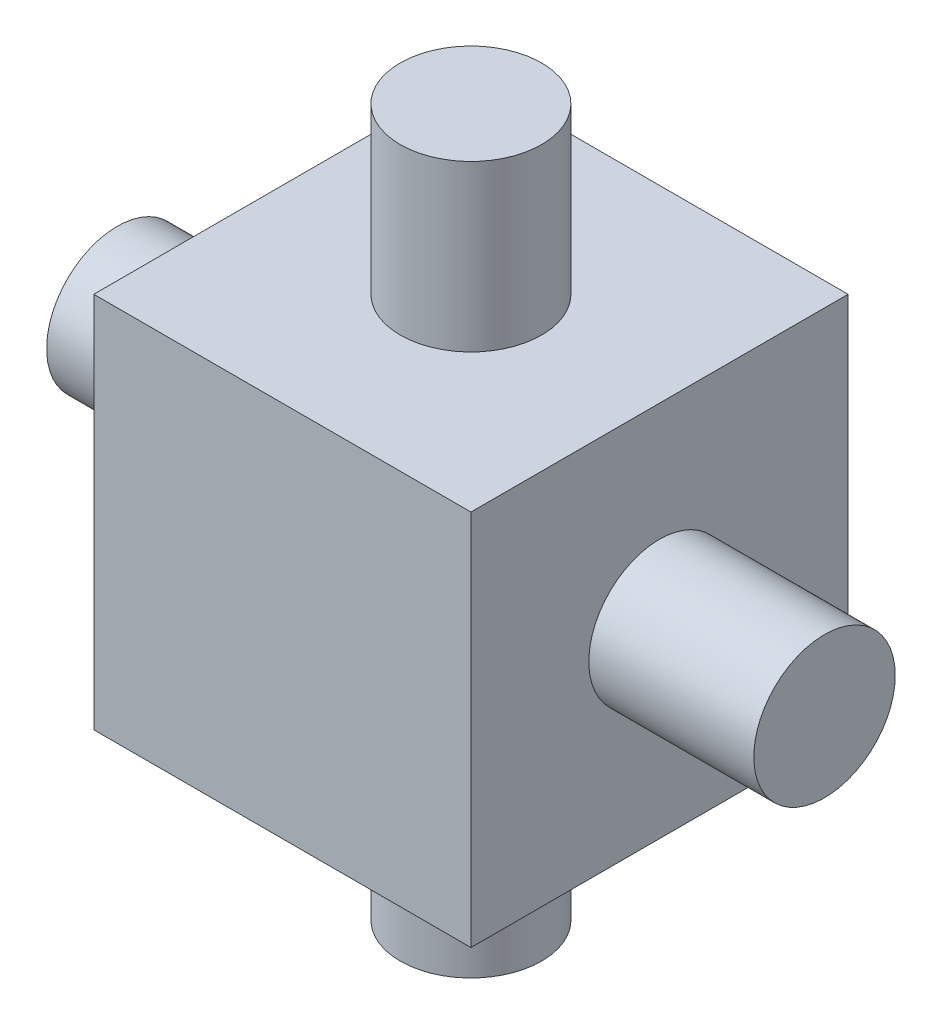
ISO-10303-21;
HEADER;
FILE_DESCRIPTION(('STEP AP214'),'2;1');
FILE_NAME('part.step','',(''),(''),'','','');
FILE_SCHEMA(('AUTOMOTIVE_DESIGN { 1 0 10303 214 1 1 1 1 }'));
ENDSEC;
DATA;
#1=APPLICATION_CONTEXT('core data for automotive mechanical design processes');
#2=APPLICATION_PROTOCOL_DEFINITION('international standard','automotive_design',2000,#1);
#3=PRODUCT_CONTEXT('',#1,'mechanical');
#4=PRODUCT('Part','Part','',(#3));
#5=PRODUCT_RELATED_PRODUCT_CATEGORY('part','',(#4));
#6=PRODUCT_DEFINITION_FORMATION('','',#4);
#7=PRODUCT_DEFINITION_CONTEXT('part definition',#1,'design');
#8=PRODUCT_DEFINITION('design','',#6,#7);
#9=PRODUCT_DEFINITION_SHAPE('','',#8);
#10=(LENGTH_UNIT() NAMED_UNIT(*) SI_UNIT(.MILLI.,.METRE.));
#11=(NAMED_UNIT(*) PLANE_ANGLE_UNIT() SI_UNIT($,.RADIAN.));
#12=(NAMED_UNIT(*) SI_UNIT($,.STERADIAN.) SOLID_ANGLE_UNIT());
#13=UNCERTAINTY_MEASURE_WITH_UNIT(LENGTH_MEASURE(1.E-05),#10,'distance_accuracy_value','');
#14=(GEOMETRIC_REPRESENTATION_CONTEXT(3) GLOBAL_UNCERTAINTY_ASSIGNED_CONTEXT((#13)) GLOBAL_UNIT_ASSIGNED_CONTEXT((#10,
#11,#12)) REPRESENTATION_CONTEXT('',''));
#15=CARTESIAN_POINT('',(0.,0.,0.));
#16=DIRECTION('',(0.,0.,1.));
#17=DIRECTION('',(1.,0.,0.));
#18=AXIS2_PLACEMENT_3D('',#15,#16,#17);
#19=CARTESIAN_POINT('',(-20.,-20.,40.));
#20=DIRECTION('',(1.,0.,0.));
#21=DIRECTION('',(0.,0.,-1.));
#22=AXIS2_PLACEMENT_3D('',#19,#20,#21);
#23=PLANE('',#22);
#24=CARTESIAN_POINT('',(-20.,0.,20.));
#25=DIRECTION('',(1.,0.,0.));
#26=DIRECTION('',(0.,0.,-1.));
#27=AXIS2_PLACEMENT_3D('',#24,#25,#26);
#28=CIRCLE('',#27,7.5);
#29=CARTESIAN_POINT('',(-20.,0.,12.5));
#30=VERTEX_POINT('',#29);
#31=EDGE_CURVE('E155',#30,#30,#28,.T.);
#32=ORIENTED_EDGE('',*,*,#31,.T.);
#33=EDGE_LOOP('',(#32));
#34=FACE_BOUND('',#33,.T.);
#35=DIRECTION('',(0.,-1.,0.));
#36=VECTOR('',#35,1.);
#37=CARTESIAN_POINT('',(-20.,-20.,0.));
#38=LINE('',#37,#36);
#39=CARTESIAN_POINT('',(-20.,20.,0.));
#40=VERTEX_POINT('',#39);
#41=CARTESIAN_POINT('',(-20.,-20.,0.));
#42=VERTEX_POINT('',#41);
#43=EDGE_CURVE('E115',#40,#42,#38,.T.);
#44=ORIENTED_EDGE('',*,*,#43,.T.);
#45=DIRECTION('',(0.,0.,-1.));
#46=VECTOR('',#45,1.);
#47=CARTESIAN_POINT('',(-20.,-20.,40.));
#48=LINE('',#47,#46);
#49=CARTESIAN_POINT('',(-20.,-20.,40.));
#50=VERTEX_POINT('',#49);
#51=EDGE_CURVE('E46',#50,#42,#48,.T.);
#52=ORIENTED_EDGE('',*,*,#51,.F.);
#53=DIRECTION('',(0.,-1.,0.));
#54=VECTOR('',#53,1.);
#55=CARTESIAN_POINT('',(-20.,-20.,40.));
#56=LINE('',#55,#54);
#57=CARTESIAN_POINT('',(-20.,20.,40.));
#58=VERTEX_POINT('',#57);
#59=EDGE_CURVE('E98',#58,#50,#56,.T.);
#60=ORIENTED_EDGE('',*,*,#59,.F.);
#61=DIRECTION('',(0.,0.,-1.));
#62=VECTOR('',#61,1.);
#63=CARTESIAN_POINT('',(-20.,20.,40.));
#64=LINE('',#63,#62);
#65=EDGE_CURVE('E111',#58,#40,#64,.T.);
#66=ORIENTED_EDGE('',*,*,#65,.T.);
#67=EDGE_LOOP('',(#44,#52,#60,#66));
#68=FACE_BOUND('',#67,.T.);
#69=ADVANCED_FACE('F43',(#34,#68),#23,.F.);
#70=CARTESIAN_POINT('',(20.,-20.,40.));
#71=DIRECTION('',(0.,1.,0.));
#72=DIRECTION('',(-1.,0.,0.));
#73=AXIS2_PLACEMENT_3D('',#70,#71,#72);
#74=PLANE('',#73);
#75=CARTESIAN_POINT('',(0.,-20.,20.));
#76=DIRECTION('',(0.,1.,0.));
#77=DIRECTION('',(0.,0.,1.));
#78=AXIS2_PLACEMENT_3D('',#75,#76,#77);
#79=CIRCLE('',#78,7.5);
#80=CARTESIAN_POINT('',(0.,-20.,27.5));
#81=VERTEX_POINT('',#80);
#82=EDGE_CURVE('E143',#81,#81,#79,.T.);
#83=ORIENTED_EDGE('',*,*,#82,.T.);
#84=EDGE_LOOP('',(#83));
#85=FACE_BOUND('',#84,.T.);
#86=DIRECTION('',(1.,0.,0.));
#87=VECTOR('',#86,1.);
#88=CARTESIAN_POINT('',(20.,-20.,0.));
#89=LINE('',#88,#87);
#90=CARTESIAN_POINT('',(20.,-20.,0.));
#91=VERTEX_POINT('',#90);
#92=EDGE_CURVE('E104',#42,#91,#89,.T.);
#93=ORIENTED_EDGE('',*,*,#92,.T.);
#94=DIRECTION('',(0.,0.,-1.));
#95=VECTOR('',#94,1.);
#96=CARTESIAN_POINT('',(20.,-20.,40.));
#97=LINE('',#96,#95);
#98=CARTESIAN_POINT('',(20.,-20.,40.));
#99=VERTEX_POINT('',#98);
#100=EDGE_CURVE('E102',#99,#91,#97,.T.);
#101=ORIENTED_EDGE('',*,*,#100,.F.);
#102=DIRECTION('',(1.,0.,0.));
#103=VECTOR('',#102,1.);
#104=CARTESIAN_POINT('',(20.,-20.,40.));
#105=LINE('',#104,#103);
#106=EDGE_CURVE('E93',#50,#99,#105,.T.);
#107=ORIENTED_EDGE('',*,*,#106,.F.);
#108=ORIENTED_EDGE('',*,*,#51,.T.);
#109=EDGE_LOOP('',(#93,#101,#107,#108));
#110=FACE_BOUND('',#109,.T.);
#111=ADVANCED_FACE('F103',(#85,#110),#74,.F.);
#112=CARTESIAN_POINT('',(20.,-20.,40.));
#113=DIRECTION('',(-1.,0.,0.));
#114=DIRECTION('',(0.,0.,1.));
#115=AXIS2_PLACEMENT_3D('',#112,#113,#114);
#116=PLANE('',#115);
#117=CARTESIAN_POINT('',(20.,0.,20.));
#118=DIRECTION('',(1.,0.,0.));
#119=DIRECTION('',(0.,0.,-1.));
#120=AXIS2_PLACEMENT_3D('',#117,#118,#119);
#121=CIRCLE('',#120,7.5);
#122=CARTESIAN_POINT('',(20.,0.,12.5));
#123=VERTEX_POINT('',#122);
#124=EDGE_CURVE('E11',#123,#123,#121,.T.);
#125=ORIENTED_EDGE('',*,*,#124,.F.);
#126=EDGE_LOOP('',(#125));
#127=FACE_BOUND('',#126,.T.);
#128=DIRECTION('',(0.,1.,0.));
#129=VECTOR('',#128,1.);
#130=CARTESIAN_POINT('',(20.,-20.,0.));
#131=LINE('',#130,#129);
#132=CARTESIAN_POINT('',(20.,20.,0.));
#133=VERTEX_POINT('',#132);
#134=EDGE_CURVE('E79',#91,#133,#131,.T.);
#135=ORIENTED_EDGE('',*,*,#134,.T.);
#136=DIRECTION('',(0.,0.,-1.));
#137=VECTOR('',#136,1.);
#138=CARTESIAN_POINT('',(20.,20.,40.));
#139=LINE('',#138,#137);
#140=CARTESIAN_POINT('',(20.,20.,40.));
#141=VERTEX_POINT('',#140);
#142=EDGE_CURVE('E106',#141,#133,#139,.T.);
#143=ORIENTED_EDGE('',*,*,#142,.F.);
#144=DIRECTION('',(0.,1.,0.));
#145=VECTOR('',#144,1.);
#146=CARTESIAN_POINT('',(20.,-20.,40.));
#147=LINE('',#146,#145);
#148=EDGE_CURVE('E96',#99,#141,#147,.T.);
#149=ORIENTED_EDGE('',*,*,#148,.F.);
#150=ORIENTED_EDGE('',*,*,#100,.T.);
#151=EDGE_LOOP('',(#135,#143,#149,#150));
#152=FACE_BOUND('',#151,.T.);
#153=ADVANCED_FACE('F107',(#127,#152),#116,.F.);
#154=CARTESIAN_POINT('',(20.,20.,40.));
#155=DIRECTION('',(0.,-1.,0.));
#156=DIRECTION('',(1.,0.,0.));
#157=AXIS2_PLACEMENT_3D('',#154,#155,#156);
#158=PLANE('',#157);
#159=CARTESIAN_POINT('',(0.,20.,20.));
#160=DIRECTION('',(0.,1.,0.));
#161=DIRECTION('',(0.,0.,1.));
#162=AXIS2_PLACEMENT_3D('',#159,#160,#161);
#163=CIRCLE('',#162,7.5);
#164=CARTESIAN_POINT('',(0.,20.,27.5));
#165=VERTEX_POINT('',#164);
#166=EDGE_CURVE('E53',#165,#165,#163,.T.);
#167=ORIENTED_EDGE('',*,*,#166,.F.);
#168=EDGE_LOOP('',(#167));
#169=FACE_BOUND('',#168,.T.);
#170=DIRECTION('',(-1.,0.,0.));
#171=VECTOR('',#170,1.);
#172=CARTESIAN_POINT('',(20.,20.,0.));
#173=LINE('',#172,#171);
#174=EDGE_CURVE('E85',#133,#40,#173,.T.);
#175=ORIENTED_EDGE('',*,*,#174,.T.);
#176=ORIENTED_EDGE('',*,*,#65,.F.);
#177=DIRECTION('',(-1.,0.,0.));
#178=VECTOR('',#177,1.);
#179=CARTESIAN_POINT('',(20.,20.,40.));
#180=LINE('',#179,#178);
#181=EDGE_CURVE('E62',#141,#58,#180,.T.);
#182=ORIENTED_EDGE('',*,*,#181,.F.);
#183=ORIENTED_EDGE('',*,*,#142,.T.);
#184=EDGE_LOOP('',(#175,#176,#182,#183));
#185=FACE_BOUND('',#184,.T.);
#186=ADVANCED_FACE('F129',(#169,#185),#158,.F.);
#187=CARTESIAN_POINT('',(0.,0.,40.));
#188=DIRECTION('',(0.,0.,1.));
#189=DIRECTION('',(1.,0.,0.));
#190=AXIS2_PLACEMENT_3D('',#187,#188,#189);
#191=PLANE('',#190);
#192=ORIENTED_EDGE('',*,*,#59,.T.);
#193=ORIENTED_EDGE('',*,*,#106,.T.);
#194=ORIENTED_EDGE('',*,*,#148,.T.);
#195=ORIENTED_EDGE('',*,*,#181,.T.);
#196=EDGE_LOOP('',(#192,#193,#194,#195));
#197=FACE_BOUND('',#196,.T.);
#198=ADVANCED_FACE('F94',(#197),#191,.T.);
#199=CARTESIAN_POINT('',(0.,0.,0.));
#200=DIRECTION('',(0.,0.,1.));
#201=DIRECTION('',(1.,0.,0.));
#202=AXIS2_PLACEMENT_3D('',#199,#200,#201);
#203=PLANE('',#202);
#204=ORIENTED_EDGE('',*,*,#43,.F.);
#205=ORIENTED_EDGE('',*,*,#174,.F.);
#206=ORIENTED_EDGE('',*,*,#134,.F.);
#207=ORIENTED_EDGE('',*,*,#92,.F.);
#208=EDGE_LOOP('',(#204,#205,#206,#207));
#209=FACE_BOUND('',#208,.T.);
#210=ADVANCED_FACE('F132',(#209),#203,.F.);
#211=CARTESIAN_POINT('',(0.,37.5,20.));
#212=DIRECTION('',(0.,-1.,0.));
#213=DIRECTION('',(0.,0.,-1.));
#214=AXIS2_PLACEMENT_3D('',#211,#212,#213);
#215=CYLINDRICAL_SURFACE('',#214,7.5);
#216=CARTESIAN_POINT('',(0.,37.5,20.));
#217=DIRECTION('',(0.,1.,0.));
#218=DIRECTION('',(0.,0.,1.));
#219=AXIS2_PLACEMENT_3D('',#216,#217,#218);
#220=CIRCLE('',#219,7.5);
#221=CARTESIAN_POINT('',(0.,37.5,27.5));
#222=VERTEX_POINT('',#221);
#223=EDGE_CURVE('E119',#222,#222,#220,.T.);
#224=ORIENTED_EDGE('',*,*,#223,.F.);
#225=EDGE_LOOP('',(#224));
#226=FACE_BOUND('',#225,.T.);
#227=ORIENTED_EDGE('',*,*,#166,.T.);
#228=EDGE_LOOP('',(#227));
#229=FACE_BOUND('',#228,.T.);
#230=ADVANCED_FACE('F192',(#226,#229),#215,.T.);
#231=CARTESIAN_POINT('',(0.,37.5,20.));
#232=DIRECTION('',(0.,1.,0.));
#233=DIRECTION('',(0.,0.,1.));
#234=AXIS2_PLACEMENT_3D('',#231,#232,#233);
#235=PLANE('',#234);
#236=ORIENTED_EDGE('',*,*,#223,.T.);
#237=EDGE_LOOP('',(#236));
#238=FACE_BOUND('',#237,.T.);
#239=ADVANCED_FACE('F197',(#238),#235,.T.);
#240=CARTESIAN_POINT('',(0.,-37.5,20.));
#241=DIRECTION('',(0.,1.,0.));
#242=DIRECTION('',(0.,0.,1.));
#243=AXIS2_PLACEMENT_3D('',#240,#241,#242);
#244=CYLINDRICAL_SURFACE('',#243,7.5);
#245=CARTESIAN_POINT('',(0.,-37.5,20.));
#246=DIRECTION('',(0.,1.,0.));
#247=DIRECTION('',(0.,0.,1.));
#248=AXIS2_PLACEMENT_3D('',#245,#246,#247);
#249=CIRCLE('',#248,7.5);
#250=CARTESIAN_POINT('',(0.,-37.5,27.5));
#251=VERTEX_POINT('',#250);
#252=EDGE_CURVE('E142',#251,#251,#249,.T.);
#253=ORIENTED_EDGE('',*,*,#252,.T.);
#254=EDGE_LOOP('',(#253));
#255=FACE_BOUND('',#254,.T.);
#256=ORIENTED_EDGE('',*,*,#82,.F.);
#257=EDGE_LOOP('',(#256));
#258=FACE_BOUND('',#257,.T.);
#259=ADVANCED_FACE('F201',(#255,#258),#244,.T.);
#260=CARTESIAN_POINT('',(0.,-37.5,20.));
#261=DIRECTION('',(0.,-1.,0.));
#262=DIRECTION('',(0.,0.,1.));
#263=AXIS2_PLACEMENT_3D('',#260,#261,#262);
#264=PLANE('',#263);
#265=ORIENTED_EDGE('',*,*,#252,.F.);
#266=EDGE_LOOP('',(#265));
#267=FACE_BOUND('',#266,.T.);
#268=ADVANCED_FACE('F205',(#267),#264,.T.);
#269=CARTESIAN_POINT('',(37.5,0.,20.));
#270=DIRECTION('',(-1.,0.,0.));
#271=DIRECTION('',(0.,0.,1.));
#272=AXIS2_PLACEMENT_3D('',#269,#270,#271);
#273=CYLINDRICAL_SURFACE('',#272,7.5);
#274=CARTESIAN_POINT('',(37.5,0.,20.));
#275=DIRECTION('',(1.,0.,0.));
#276=DIRECTION('',(0.,0.,-1.));
#277=AXIS2_PLACEMENT_3D('',#274,#275,#276);
#278=CIRCLE('',#277,7.5);
#279=CARTESIAN_POINT('',(37.5,0.,12.5));
#280=VERTEX_POINT('',#279);
#281=EDGE_CURVE('E147',#280,#280,#278,.T.);
#282=ORIENTED_EDGE('',*,*,#281,.F.);
#283=EDGE_LOOP('',(#282));
#284=FACE_BOUND('',#283,.T.);
#285=ORIENTED_EDGE('',*,*,#124,.T.);
#286=EDGE_LOOP('',(#285));
#287=FACE_BOUND('',#286,.T.);
#288=ADVANCED_FACE('F209',(#284,#287),#273,.T.);
#289=CARTESIAN_POINT('',(37.5,0.,20.));
#290=DIRECTION('',(1.,0.,0.));
#291=DIRECTION('',(0.,0.,-1.));
#292=AXIS2_PLACEMENT_3D('',#289,#290,#291);
#293=PLANE('',#292);
#294=ORIENTED_EDGE('',*,*,#281,.T.);
#295=EDGE_LOOP('',(#294));
#296=FACE_BOUND('',#295,.T.);
#297=ADVANCED_FACE('F172',(#296),#293,.T.);
#298=CARTESIAN_POINT('',(-37.5,0.,20.));
#299=DIRECTION('',(1.,0.,0.));
#300=DIRECTION('',(0.,0.,-1.));
#301=AXIS2_PLACEMENT_3D('',#298,#299,#300);
#302=CYLINDRICAL_SURFACE('',#301,7.5);
#303=CARTESIAN_POINT('',(-37.5,0.,20.));
#304=DIRECTION('',(1.,0.,0.));
#305=DIRECTION('',(0.,0.,-1.));
#306=AXIS2_PLACEMENT_3D('',#303,#304,#305);
#307=CIRCLE('',#306,7.5);
#308=CARTESIAN_POINT('',(-37.5,0.,12.5));
#309=VERTEX_POINT('',#308);
#310=EDGE_CURVE('E154',#309,#309,#307,.T.);
#311=ORIENTED_EDGE('',*,*,#310,.T.);
#312=EDGE_LOOP('',(#311));
#313=FACE_BOUND('',#312,.T.);
#314=ORIENTED_EDGE('',*,*,#31,.F.);
#315=EDGE_LOOP('',(#314));
#316=FACE_BOUND('',#315,.T.);
#317=ADVANCED_FACE('F163',(#313,#316),#302,.T.);
#318=CARTESIAN_POINT('',(-37.5,0.,20.));
#319=DIRECTION('',(-1.,0.,0.));
#320=DIRECTION('',(0.,0.,-1.));
#321=AXIS2_PLACEMENT_3D('',#318,#319,#320);
#322=PLANE('',#321);
#323=ORIENTED_EDGE('',*,*,#310,.F.);
#324=EDGE_LOOP('',(#323));
#325=FACE_BOUND('',#324,.T.);
#326=ADVANCED_FACE('F166',(#325),#322,.T.);
#327=CLOSED_SHELL('',(#69,#111,#153,#186,#198,#210,#230,#239,#259,#268,#288,#297,#317,#326));
#328=MANIFOLD_SOLID_BREP('B2',#327);
#329=ADVANCED_BREP_SHAPE_REPRESENTATION('',(#18,#328),#14);
#330=SHAPE_DEFINITION_REPRESENTATION(#9,#329);
ENDSEC;
END-ISO-10303-21;
